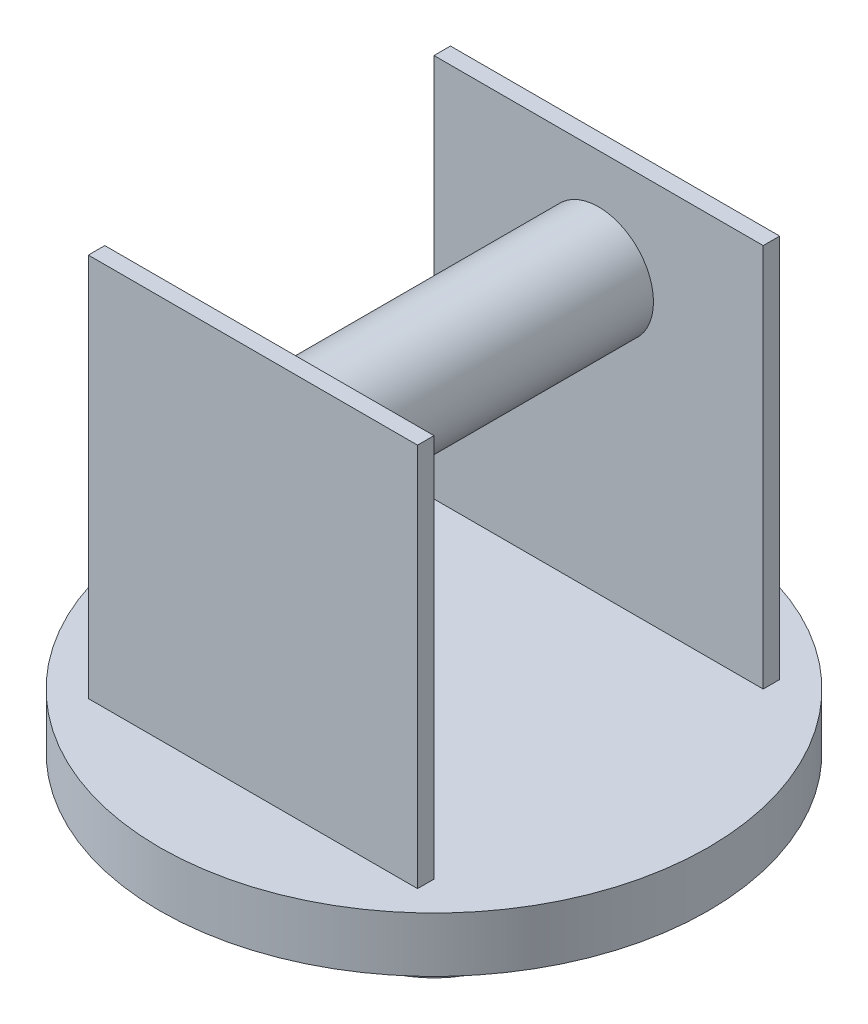
ISO-10303-21;
HEADER;
FILE_DESCRIPTION(('STEP AP214'),'2;1');
FILE_NAME('part.step','',(''),(''),'','','');
FILE_SCHEMA(('AUTOMOTIVE_DESIGN { 1 0 10303 214 1 1 1 1 }'));
ENDSEC;
DATA;
#1=APPLICATION_CONTEXT('core data for automotive mechanical design processes');
#2=APPLICATION_PROTOCOL_DEFINITION('international standard','automotive_design',2000,#1);
#3=PRODUCT_CONTEXT('',#1,'mechanical');
#4=PRODUCT('Part','Part','',(#3));
#5=PRODUCT_RELATED_PRODUCT_CATEGORY('part','',(#4));
#6=PRODUCT_DEFINITION_FORMATION('','',#4);
#7=PRODUCT_DEFINITION_CONTEXT('part definition',#1,'design');
#8=PRODUCT_DEFINITION('design','',#6,#7);
#9=PRODUCT_DEFINITION_SHAPE('','',#8);
#10=(LENGTH_UNIT() NAMED_UNIT(*) SI_UNIT(.MILLI.,.METRE.));
#11=(NAMED_UNIT(*) PLANE_ANGLE_UNIT() SI_UNIT($,.RADIAN.));
#12=(NAMED_UNIT(*) SI_UNIT($,.STERADIAN.) SOLID_ANGLE_UNIT());
#13=UNCERTAINTY_MEASURE_WITH_UNIT(LENGTH_MEASURE(1.E-05),#10,'distance_accuracy_value','');
#14=(GEOMETRIC_REPRESENTATION_CONTEXT(3) GLOBAL_UNCERTAINTY_ASSIGNED_CONTEXT((#13)) GLOBAL_UNIT_ASSIGNED_CONTEXT((#10,
#11,#12)) REPRESENTATION_CONTEXT('',''));
#15=CARTESIAN_POINT('',(0.,0.,0.));
#16=DIRECTION('',(0.,0.,1.));
#17=DIRECTION('',(1.,0.,0.));
#18=AXIS2_PLACEMENT_3D('',#15,#16,#17);
#19=CARTESIAN_POINT('',(0.,10.,0.));
#20=DIRECTION('',(0.,1.,0.));
#21=DIRECTION('',(0.,0.,1.));
#22=AXIS2_PLACEMENT_3D('',#19,#20,#21);
#23=PLANE('',#22);
#24=CARTESIAN_POINT('',(0.,10.,0.));
#25=DIRECTION('',(0.,1.,0.));
#26=DIRECTION('',(0.,0.,1.));
#27=AXIS2_PLACEMENT_3D('',#24,#25,#26);
#28=CIRCLE('',#27,50.);
#29=CARTESIAN_POINT('',(0.,10.,50.));
#30=VERTEX_POINT('',#29);
#31=EDGE_CURVE('E43',#30,#30,#28,.T.);
#32=ORIENTED_EDGE('',*,*,#31,.T.);
#33=EDGE_LOOP('',(#32));
#34=FACE_BOUND('',#33,.T.);
#35=DIRECTION('',(1.,0.,0.));
#36=VECTOR('',#35,1.);
#37=CARTESIAN_POINT('',(-30.,10.,33.));
#38=LINE('',#37,#36);
#39=CARTESIAN_POINT('',(-30.,10.,33.));
#40=VERTEX_POINT('',#39);
#41=CARTESIAN_POINT('',(30.,10.,33.));
#42=VERTEX_POINT('',#41);
#43=EDGE_CURVE('E130',#40,#42,#38,.T.);
#44=ORIENTED_EDGE('',*,*,#43,.F.);
#45=DIRECTION('',(0.,0.,1.));
#46=VECTOR('',#45,1.);
#47=CARTESIAN_POINT('',(-30.,10.,33.));
#48=LINE('',#47,#46);
#49=CARTESIAN_POINT('',(-30.,10.,30.));
#50=VERTEX_POINT('',#49);
#51=EDGE_CURVE('E127',#50,#40,#48,.T.);
#52=ORIENTED_EDGE('',*,*,#51,.F.);
#53=DIRECTION('',(-1.,0.,0.));
#54=VECTOR('',#53,1.);
#55=CARTESIAN_POINT('',(-30.,10.,30.));
#56=LINE('',#55,#54);
#57=CARTESIAN_POINT('',(30.,10.,30.));
#58=VERTEX_POINT('',#57);
#59=EDGE_CURVE('E139',#58,#50,#56,.T.);
#60=ORIENTED_EDGE('',*,*,#59,.F.);
#61=DIRECTION('',(0.,0.,-1.));
#62=VECTOR('',#61,1.);
#63=CARTESIAN_POINT('',(30.,10.,33.));
#64=LINE('',#63,#62);
#65=EDGE_CURVE('E147',#42,#58,#64,.T.);
#66=ORIENTED_EDGE('',*,*,#65,.F.);
#67=EDGE_LOOP('',(#44,#52,#60,#66));
#68=FACE_BOUND('',#67,.T.);
#69=DIRECTION('',(1.,0.,0.));
#70=VECTOR('',#69,1.);
#71=CARTESIAN_POINT('',(-30.,10.,-30.));
#72=LINE('',#71,#70);
#73=CARTESIAN_POINT('',(-30.,10.,-30.));
#74=VERTEX_POINT('',#73);
#75=CARTESIAN_POINT('',(30.,10.,-30.));
#76=VERTEX_POINT('',#75);
#77=EDGE_CURVE('E236',#74,#76,#72,.T.);
#78=ORIENTED_EDGE('',*,*,#77,.F.);
#79=DIRECTION('',(0.,0.,1.));
#80=VECTOR('',#79,1.);
#81=CARTESIAN_POINT('',(-30.,10.,-30.));
#82=LINE('',#81,#80);
#83=CARTESIAN_POINT('',(-30.,10.,-33.));
#84=VERTEX_POINT('',#83);
#85=EDGE_CURVE('E125',#84,#74,#82,.T.);
#86=ORIENTED_EDGE('',*,*,#85,.F.);
#87=DIRECTION('',(-1.,0.,0.));
#88=VECTOR('',#87,1.);
#89=CARTESIAN_POINT('',(-30.,10.,-33.));
#90=LINE('',#89,#88);
#91=CARTESIAN_POINT('',(30.,10.,-33.));
#92=VERTEX_POINT('',#91);
#93=EDGE_CURVE('E121',#92,#84,#90,.T.);
#94=ORIENTED_EDGE('',*,*,#93,.F.);
#95=DIRECTION('',(0.,0.,-1.));
#96=VECTOR('',#95,1.);
#97=CARTESIAN_POINT('',(30.,10.,-30.));
#98=LINE('',#97,#96);
#99=EDGE_CURVE('E244',#76,#92,#98,.T.);
#100=ORIENTED_EDGE('',*,*,#99,.F.);
#101=EDGE_LOOP('',(#78,#86,#94,#100));
#102=FACE_BOUND('',#101,.T.);
#103=ADVANCED_FACE('F34',(#34,#68,#102),#23,.T.);
#104=CARTESIAN_POINT('',(0.,10.,0.));
#105=DIRECTION('',(0.,-1.,0.));
#106=DIRECTION('',(0.,0.,-1.));
#107=AXIS2_PLACEMENT_3D('',#104,#105,#106);
#108=CYLINDRICAL_SURFACE('',#107,50.);
#109=ORIENTED_EDGE('',*,*,#31,.F.);
#110=EDGE_LOOP('',(#109));
#111=FACE_BOUND('',#110,.T.);
#112=CARTESIAN_POINT('',(0.,0.,0.));
#113=DIRECTION('',(0.,1.,0.));
#114=DIRECTION('',(0.,0.,1.));
#115=AXIS2_PLACEMENT_3D('',#112,#113,#114);
#116=CIRCLE('',#115,50.);
#117=CARTESIAN_POINT('',(0.,0.,50.));
#118=VERTEX_POINT('',#117);
#119=EDGE_CURVE('E38',#118,#118,#116,.T.);
#120=ORIENTED_EDGE('',*,*,#119,.T.);
#121=EDGE_LOOP('',(#120));
#122=FACE_BOUND('',#121,.T.);
#123=ADVANCED_FACE('F36',(#111,#122),#108,.T.);
#124=CARTESIAN_POINT('',(0.,0.,0.));
#125=DIRECTION('',(0.,1.,0.));
#126=DIRECTION('',(0.,0.,1.));
#127=AXIS2_PLACEMENT_3D('',#124,#125,#126);
#128=PLANE('',#127);
#129=CARTESIAN_POINT('',(0.,0.,0.));
#130=DIRECTION('',(0.,-1.,0.));
#131=DIRECTION('',(0.,0.,-1.));
#132=AXIS2_PLACEMENT_3D('',#129,#130,#131);
#133=CIRCLE('',#132,15.);
#134=CARTESIAN_POINT('',(0.,0.,-15.));
#135=VERTEX_POINT('',#134);
#136=EDGE_CURVE('E11',#135,#135,#133,.T.);
#137=ORIENTED_EDGE('',*,*,#136,.F.);
#138=EDGE_LOOP('',(#137));
#139=FACE_BOUND('',#138,.T.);
#140=ORIENTED_EDGE('',*,*,#119,.F.);
#141=EDGE_LOOP('',(#140));
#142=FACE_BOUND('',#141,.T.);
#143=ADVANCED_FACE('F167',(#139,#142),#128,.F.);
#144=CARTESIAN_POINT('',(0.,-25.,0.));
#145=DIRECTION('',(0.,1.,0.));
#146=DIRECTION('',(0.,0.,1.));
#147=AXIS2_PLACEMENT_3D('',#144,#145,#146);
#148=CYLINDRICAL_SURFACE('',#147,15.);
#149=CARTESIAN_POINT('',(0.,-25.,0.));
#150=DIRECTION('',(0.,-1.,0.));
#151=DIRECTION('',(0.,0.,-1.));
#152=AXIS2_PLACEMENT_3D('',#149,#150,#151);
#153=CIRCLE('',#152,15.);
#154=CARTESIAN_POINT('',(0.,-25.,-15.));
#155=VERTEX_POINT('',#154);
#156=EDGE_CURVE('E158',#155,#155,#153,.T.);
#157=ORIENTED_EDGE('',*,*,#156,.F.);
#158=EDGE_LOOP('',(#157));
#159=FACE_BOUND('',#158,.T.);
#160=ORIENTED_EDGE('',*,*,#136,.T.);
#161=EDGE_LOOP('',(#160));
#162=FACE_BOUND('',#161,.T.);
#163=ADVANCED_FACE('F169',(#159,#162),#148,.T.);
#164=CARTESIAN_POINT('',(0.,-25.,0.));
#165=DIRECTION('',(0.,-1.,0.));
#166=DIRECTION('',(0.,0.,-1.));
#167=AXIS2_PLACEMENT_3D('',#164,#165,#166);
#168=PLANE('',#167);
#169=ORIENTED_EDGE('',*,*,#156,.T.);
#170=EDGE_LOOP('',(#169));
#171=FACE_BOUND('',#170,.T.);
#172=ADVANCED_FACE('F175',(#171),#168,.T.);
#173=CARTESIAN_POINT('',(-30.,80.,33.));
#174=DIRECTION('',(1.,0.,0.));
#175=DIRECTION('',(0.,0.,-1.));
#176=AXIS2_PLACEMENT_3D('',#173,#174,#175);
#177=PLANE('',#176);
#178=ORIENTED_EDGE('',*,*,#51,.T.);
#179=DIRECTION('',(0.,-1.,0.));
#180=VECTOR('',#179,1.);
#181=CARTESIAN_POINT('',(-30.,80.,33.));
#182=LINE('',#181,#180);
#183=CARTESIAN_POINT('',(-30.,80.,33.));
#184=VERTEX_POINT('',#183);
#185=EDGE_CURVE('E156',#184,#40,#182,.T.);
#186=ORIENTED_EDGE('',*,*,#185,.F.);
#187=DIRECTION('',(0.,0.,1.));
#188=VECTOR('',#187,1.);
#189=CARTESIAN_POINT('',(-30.,80.,33.));
#190=LINE('',#189,#188);
#191=CARTESIAN_POINT('',(-30.,80.,30.));
#192=VERTEX_POINT('',#191);
#193=EDGE_CURVE('E135',#192,#184,#190,.T.);
#194=ORIENTED_EDGE('',*,*,#193,.F.);
#195=DIRECTION('',(0.,-1.,0.));
#196=VECTOR('',#195,1.);
#197=CARTESIAN_POINT('',(-30.,80.,30.));
#198=LINE('',#197,#196);
#199=EDGE_CURVE('E144',#192,#50,#198,.T.);
#200=ORIENTED_EDGE('',*,*,#199,.T.);
#201=EDGE_LOOP('',(#178,#186,#194,#200));
#202=FACE_BOUND('',#201,.T.);
#203=ADVANCED_FACE('F188',(#202),#177,.F.);
#204=CARTESIAN_POINT('',(-30.,80.,33.));
#205=DIRECTION('',(0.,0.,-1.));
#206=DIRECTION('',(-1.,0.,0.));
#207=AXIS2_PLACEMENT_3D('',#204,#205,#206);
#208=PLANE('',#207);
#209=ORIENTED_EDGE('',*,*,#43,.T.);
#210=DIRECTION('',(0.,-1.,0.));
#211=VECTOR('',#210,1.);
#212=CARTESIAN_POINT('',(30.,80.,33.));
#213=LINE('',#212,#211);
#214=CARTESIAN_POINT('',(30.,80.,33.));
#215=VERTEX_POINT('',#214);
#216=EDGE_CURVE('E153',#215,#42,#213,.T.);
#217=ORIENTED_EDGE('',*,*,#216,.F.);
#218=DIRECTION('',(1.,0.,0.));
#219=VECTOR('',#218,1.);
#220=CARTESIAN_POINT('',(-30.,80.,33.));
#221=LINE('',#220,#219);
#222=EDGE_CURVE('E138',#184,#215,#221,.T.);
#223=ORIENTED_EDGE('',*,*,#222,.F.);
#224=ORIENTED_EDGE('',*,*,#185,.T.);
#225=EDGE_LOOP('',(#209,#217,#223,#224));
#226=FACE_BOUND('',#225,.T.);
#227=ADVANCED_FACE('F192',(#226),#208,.F.);
#228=CARTESIAN_POINT('',(30.,80.,33.));
#229=DIRECTION('',(-1.,0.,0.));
#230=DIRECTION('',(0.,0.,1.));
#231=AXIS2_PLACEMENT_3D('',#228,#229,#230);
#232=PLANE('',#231);
#233=ORIENTED_EDGE('',*,*,#65,.T.);
#234=DIRECTION('',(0.,-1.,0.));
#235=VECTOR('',#234,1.);
#236=CARTESIAN_POINT('',(30.,80.,30.));
#237=LINE('',#236,#235);
#238=CARTESIAN_POINT('',(30.,80.,30.));
#239=VERTEX_POINT('',#238);
#240=EDGE_CURVE('E59',#239,#58,#237,.T.);
#241=ORIENTED_EDGE('',*,*,#240,.F.);
#242=DIRECTION('',(0.,0.,-1.));
#243=VECTOR('',#242,1.);
#244=CARTESIAN_POINT('',(30.,80.,33.));
#245=LINE('',#244,#243);
#246=EDGE_CURVE('E141',#215,#239,#245,.T.);
#247=ORIENTED_EDGE('',*,*,#246,.F.);
#248=ORIENTED_EDGE('',*,*,#216,.T.);
#249=EDGE_LOOP('',(#233,#241,#247,#248));
#250=FACE_BOUND('',#249,.T.);
#251=ADVANCED_FACE('F196',(#250),#232,.F.);
#252=CARTESIAN_POINT('',(-30.,80.,30.));
#253=DIRECTION('',(0.,0.,1.));
#254=DIRECTION('',(1.,0.,0.));
#255=AXIS2_PLACEMENT_3D('',#252,#253,#254);
#256=PLANE('',#255);
#257=CARTESIAN_POINT('',(0.,61.1108102049651,30.));
#258=DIRECTION('',(0.,0.,1.));
#259=DIRECTION('',(1.,0.,0.));
#260=AXIS2_PLACEMENT_3D('',#257,#258,#259);
#261=CIRCLE('',#260,10.);
#262=CARTESIAN_POINT('',(10.,61.1108102049651,30.));
#263=VERTEX_POINT('',#262);
#264=EDGE_CURVE('E234',#263,#263,#261,.T.);
#265=ORIENTED_EDGE('',*,*,#264,.T.);
#266=EDGE_LOOP('',(#265));
#267=FACE_BOUND('',#266,.T.);
#268=ORIENTED_EDGE('',*,*,#59,.T.);
#269=ORIENTED_EDGE('',*,*,#199,.F.);
#270=DIRECTION('',(-1.,0.,0.));
#271=VECTOR('',#270,1.);
#272=CARTESIAN_POINT('',(-30.,80.,30.));
#273=LINE('',#272,#271);
#274=EDGE_CURVE('E143',#239,#192,#273,.T.);
#275=ORIENTED_EDGE('',*,*,#274,.F.);
#276=ORIENTED_EDGE('',*,*,#240,.T.);
#277=EDGE_LOOP('',(#268,#269,#275,#276));
#278=FACE_BOUND('',#277,.T.);
#279=ADVANCED_FACE('F200',(#267,#278),#256,.F.);
#280=CARTESIAN_POINT('',(0.,80.,0.));
#281=DIRECTION('',(0.,-1.,0.));
#282=DIRECTION('',(0.,0.,-1.));
#283=AXIS2_PLACEMENT_3D('',#280,#281,#282);
#284=PLANE('',#283);
#285=ORIENTED_EDGE('',*,*,#193,.T.);
#286=ORIENTED_EDGE('',*,*,#222,.T.);
#287=ORIENTED_EDGE('',*,*,#246,.T.);
#288=ORIENTED_EDGE('',*,*,#274,.T.);
#289=EDGE_LOOP('',(#285,#286,#287,#288));
#290=FACE_BOUND('',#289,.T.);
#291=ADVANCED_FACE('F204',(#290),#284,.F.);
#292=CARTESIAN_POINT('',(-30.,80.,-30.));
#293=DIRECTION('',(1.,0.,0.));
#294=DIRECTION('',(0.,0.,-1.));
#295=AXIS2_PLACEMENT_3D('',#292,#293,#294);
#296=PLANE('',#295);
#297=ORIENTED_EDGE('',*,*,#85,.T.);
#298=DIRECTION('',(0.,-1.,0.));
#299=VECTOR('',#298,1.);
#300=CARTESIAN_POINT('',(-30.,80.,-30.));
#301=LINE('',#300,#299);
#302=CARTESIAN_POINT('',(-30.,80.,-30.));
#303=VERTEX_POINT('',#302);
#304=EDGE_CURVE('E106',#303,#74,#301,.T.);
#305=ORIENTED_EDGE('',*,*,#304,.F.);
#306=DIRECTION('',(0.,0.,1.));
#307=VECTOR('',#306,1.);
#308=CARTESIAN_POINT('',(-30.,80.,-30.));
#309=LINE('',#308,#307);
#310=CARTESIAN_POINT('',(-30.,80.,-33.));
#311=VERTEX_POINT('',#310);
#312=EDGE_CURVE('E113',#311,#303,#309,.T.);
#313=ORIENTED_EDGE('',*,*,#312,.F.);
#314=DIRECTION('',(0.,-1.,0.));
#315=VECTOR('',#314,1.);
#316=CARTESIAN_POINT('',(-30.,80.,-33.));
#317=LINE('',#316,#315);
#318=EDGE_CURVE('E241',#311,#84,#317,.T.);
#319=ORIENTED_EDGE('',*,*,#318,.T.);
#320=EDGE_LOOP('',(#297,#305,#313,#319));
#321=FACE_BOUND('',#320,.T.);
#322=ADVANCED_FACE('F123',(#321),#296,.F.);
#323=CARTESIAN_POINT('',(-30.,80.,-30.));
#324=DIRECTION('',(0.,0.,-1.));
#325=DIRECTION('',(-1.,0.,0.));
#326=AXIS2_PLACEMENT_3D('',#323,#324,#325);
#327=PLANE('',#326);
#328=CARTESIAN_POINT('',(0.,61.1108102049651,-30.));
#329=DIRECTION('',(0.,0.,-1.));
#330=DIRECTION('',(-1.,0.,0.));
#331=AXIS2_PLACEMENT_3D('',#328,#329,#330);
#332=CIRCLE('',#331,10.);
#333=CARTESIAN_POINT('',(-10.,61.1108102049651,-30.));
#334=VERTEX_POINT('',#333);
#335=EDGE_CURVE('E231',#334,#334,#332,.F.);
#336=ORIENTED_EDGE('',*,*,#335,.F.);
#337=EDGE_LOOP('',(#336));
#338=FACE_BOUND('',#337,.T.);
#339=ORIENTED_EDGE('',*,*,#77,.T.);
#340=DIRECTION('',(0.,-1.,0.));
#341=VECTOR('',#340,1.);
#342=CARTESIAN_POINT('',(30.,80.,-30.));
#343=LINE('',#342,#341);
#344=CARTESIAN_POINT('',(30.,80.,-30.));
#345=VERTEX_POINT('',#344);
#346=EDGE_CURVE('E109',#345,#76,#343,.T.);
#347=ORIENTED_EDGE('',*,*,#346,.F.);
#348=DIRECTION('',(1.,0.,0.));
#349=VECTOR('',#348,1.);
#350=CARTESIAN_POINT('',(-30.,80.,-30.));
#351=LINE('',#350,#349);
#352=EDGE_CURVE('E102',#303,#345,#351,.T.);
#353=ORIENTED_EDGE('',*,*,#352,.F.);
#354=ORIENTED_EDGE('',*,*,#304,.T.);
#355=EDGE_LOOP('',(#339,#347,#353,#354));
#356=FACE_BOUND('',#355,.T.);
#357=ADVANCED_FACE('F104',(#338,#356),#327,.F.);
#358=CARTESIAN_POINT('',(30.,80.,-30.));
#359=DIRECTION('',(-1.,0.,0.));
#360=DIRECTION('',(0.,0.,1.));
#361=AXIS2_PLACEMENT_3D('',#358,#359,#360);
#362=PLANE('',#361);
#363=ORIENTED_EDGE('',*,*,#99,.T.);
#364=DIRECTION('',(0.,-1.,0.));
#365=VECTOR('',#364,1.);
#366=CARTESIAN_POINT('',(30.,80.,-33.));
#367=LINE('',#366,#365);
#368=CARTESIAN_POINT('',(30.,80.,-33.));
#369=VERTEX_POINT('',#368);
#370=EDGE_CURVE('E51',#369,#92,#367,.T.);
#371=ORIENTED_EDGE('',*,*,#370,.F.);
#372=DIRECTION('',(0.,0.,-1.));
#373=VECTOR('',#372,1.);
#374=CARTESIAN_POINT('',(30.,80.,-30.));
#375=LINE('',#374,#373);
#376=EDGE_CURVE('E112',#345,#369,#375,.T.);
#377=ORIENTED_EDGE('',*,*,#376,.F.);
#378=ORIENTED_EDGE('',*,*,#346,.T.);
#379=EDGE_LOOP('',(#363,#371,#377,#378));
#380=FACE_BOUND('',#379,.T.);
#381=ADVANCED_FACE('F213',(#380),#362,.F.);
#382=CARTESIAN_POINT('',(-30.,80.,-33.));
#383=DIRECTION('',(0.,0.,1.));
#384=DIRECTION('',(1.,0.,0.));
#385=AXIS2_PLACEMENT_3D('',#382,#383,#384);
#386=PLANE('',#385);
#387=ORIENTED_EDGE('',*,*,#93,.T.);
#388=ORIENTED_EDGE('',*,*,#318,.F.);
#389=DIRECTION('',(-1.,0.,0.));
#390=VECTOR('',#389,1.);
#391=CARTESIAN_POINT('',(-30.,80.,-33.));
#392=LINE('',#391,#390);
#393=EDGE_CURVE('E117',#369,#311,#392,.T.);
#394=ORIENTED_EDGE('',*,*,#393,.F.);
#395=ORIENTED_EDGE('',*,*,#370,.T.);
#396=EDGE_LOOP('',(#387,#388,#394,#395));
#397=FACE_BOUND('',#396,.T.);
#398=ADVANCED_FACE('F217',(#397),#386,.F.);
#399=CARTESIAN_POINT('',(0.,80.,0.));
#400=DIRECTION('',(0.,-1.,0.));
#401=DIRECTION('',(0.,0.,-1.));
#402=AXIS2_PLACEMENT_3D('',#399,#400,#401);
#403=PLANE('',#402);
#404=ORIENTED_EDGE('',*,*,#312,.T.);
#405=ORIENTED_EDGE('',*,*,#352,.T.);
#406=ORIENTED_EDGE('',*,*,#376,.T.);
#407=ORIENTED_EDGE('',*,*,#393,.T.);
#408=EDGE_LOOP('',(#404,#405,#406,#407));
#409=FACE_BOUND('',#408,.T.);
#410=ADVANCED_FACE('F116',(#409),#403,.F.);
#411=CARTESIAN_POINT('',(0.,61.1108102049651,-58.2842712474619));
#412=DIRECTION('',(0.,0.,1.));
#413=DIRECTION('',(1.,0.,0.));
#414=AXIS2_PLACEMENT_3D('',#411,#412,#413);
#415=CYLINDRICAL_SURFACE('',#414,10.);
#416=ORIENTED_EDGE('',*,*,#335,.T.);
#417=EDGE_LOOP('',(#416));
#418=FACE_BOUND('',#417,.T.);
#419=ORIENTED_EDGE('',*,*,#264,.F.);
#420=EDGE_LOOP('',(#419));
#421=FACE_BOUND('',#420,.T.);
#422=ADVANCED_FACE('F223',(#418,#421),#415,.T.);
#423=CLOSED_SHELL('',(#103,#123,#143,#163,#172,#203,#227,#251,#279,#291,#322,#357,#381,#398,
#410,#422));
#424=MANIFOLD_SOLID_BREP('B2',#423);
#425=ADVANCED_BREP_SHAPE_REPRESENTATION('',(#18,#424),#14);
#426=SHAPE_DEFINITION_REPRESENTATION(#9,#425);
ENDSEC;
END-ISO-10303-21;
